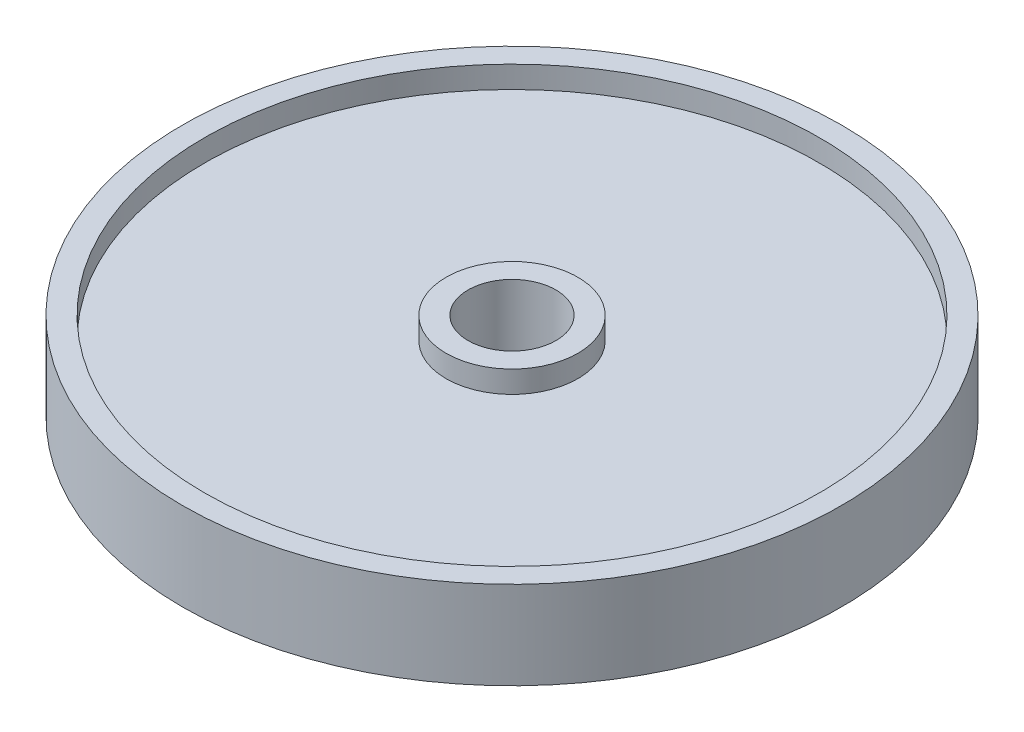
ISO-10303-21;
HEADER;
FILE_DESCRIPTION(('STEP AP214'),'2;1');
FILE_NAME('part.step','',(''),(''),'','','');
FILE_SCHEMA(('AUTOMOTIVE_DESIGN { 1 0 10303 214 1 1 1 1 }'));
ENDSEC;
DATA;
#1=APPLICATION_CONTEXT('core data for automotive mechanical design processes');
#2=APPLICATION_PROTOCOL_DEFINITION('international standard','automotive_design',2000,#1);
#3=PRODUCT_CONTEXT('',#1,'mechanical');
#4=PRODUCT('Part','Part','',(#3));
#5=PRODUCT_RELATED_PRODUCT_CATEGORY('part','',(#4));
#6=PRODUCT_DEFINITION_FORMATION('','',#4);
#7=PRODUCT_DEFINITION_CONTEXT('part definition',#1,'design');
#8=PRODUCT_DEFINITION('design','',#6,#7);
#9=PRODUCT_DEFINITION_SHAPE('','',#8);
#10=(LENGTH_UNIT() NAMED_UNIT(*) SI_UNIT(.MILLI.,.METRE.));
#11=(NAMED_UNIT(*) PLANE_ANGLE_UNIT() SI_UNIT($,.RADIAN.));
#12=(NAMED_UNIT(*) SI_UNIT($,.STERADIAN.) SOLID_ANGLE_UNIT());
#13=UNCERTAINTY_MEASURE_WITH_UNIT(LENGTH_MEASURE(1.E-05),#10,'distance_accuracy_value','');
#14=(GEOMETRIC_REPRESENTATION_CONTEXT(3) GLOBAL_UNCERTAINTY_ASSIGNED_CONTEXT((#13)) GLOBAL_UNIT_ASSIGNED_CONTEXT((#10,
#11,#12)) REPRESENTATION_CONTEXT('',''));
#15=CARTESIAN_POINT('',(0.,0.,0.));
#16=DIRECTION('',(0.,0.,1.));
#17=DIRECTION('',(1.,0.,0.));
#18=AXIS2_PLACEMENT_3D('',#15,#16,#17);
#19=CARTESIAN_POINT('',(0.,2.5,0.));
#20=DIRECTION('',(0.,1.,0.));
#21=DIRECTION('',(0.,0.,1.));
#22=AXIS2_PLACEMENT_3D('',#19,#20,#21);
#23=PLANE('',#22);
#24=CARTESIAN_POINT('',(0.,2.5,0.));
#25=DIRECTION('',(0.,1.,0.));
#26=DIRECTION('',(0.,0.,1.));
#27=AXIS2_PLACEMENT_3D('',#24,#25,#26);
#28=CIRCLE('',#27,7.5);
#29=CARTESIAN_POINT('',(0.,2.5,7.5));
#30=VERTEX_POINT('',#29);
#31=EDGE_CURVE('E11',#30,#30,#28,.T.);
#32=ORIENTED_EDGE('',*,*,#31,.F.);
#33=EDGE_LOOP('',(#32));
#34=FACE_BOUND('',#33,.T.);
#35=CARTESIAN_POINT('',(0.,2.5,0.));
#36=DIRECTION('',(0.,1.,0.));
#37=DIRECTION('',(0.,0.,1.));
#38=AXIS2_PLACEMENT_3D('',#35,#36,#37);
#39=CIRCLE('',#38,35.);
#40=CARTESIAN_POINT('',(0.,2.5,35.));
#41=VERTEX_POINT('',#40);
#42=EDGE_CURVE('E57',#41,#41,#39,.F.);
#43=ORIENTED_EDGE('',*,*,#42,.F.);
#44=EDGE_LOOP('',(#43));
#45=FACE_BOUND('',#44,.T.);
#46=ADVANCED_FACE('F46',(#34,#45),#23,.T.);
#47=CARTESIAN_POINT('',(0.,-2.5,0.));
#48=DIRECTION('',(0.,1.,0.));
#49=DIRECTION('',(0.,0.,1.));
#50=AXIS2_PLACEMENT_3D('',#47,#48,#49);
#51=PLANE('',#50);
#52=CARTESIAN_POINT('',(0.,-2.5,0.));
#53=DIRECTION('',(0.,1.,0.));
#54=DIRECTION('',(0.,0.,1.));
#55=AXIS2_PLACEMENT_3D('',#52,#53,#54);
#56=CIRCLE('',#55,7.5);
#57=CARTESIAN_POINT('',(0.,-2.5,7.5));
#58=VERTEX_POINT('',#57);
#59=EDGE_CURVE('E69',#58,#58,#56,.F.);
#60=ORIENTED_EDGE('',*,*,#59,.F.);
#61=EDGE_LOOP('',(#60));
#62=FACE_BOUND('',#61,.T.);
#63=CARTESIAN_POINT('',(0.,-2.5,0.));
#64=DIRECTION('',(0.,1.,0.));
#65=DIRECTION('',(0.,0.,1.));
#66=AXIS2_PLACEMENT_3D('',#63,#64,#65);
#67=CIRCLE('',#66,35.);
#68=CARTESIAN_POINT('',(0.,-2.5,35.));
#69=VERTEX_POINT('',#68);
#70=EDGE_CURVE('E50',#69,#69,#67,.T.);
#71=ORIENTED_EDGE('',*,*,#70,.F.);
#72=EDGE_LOOP('',(#71));
#73=FACE_BOUND('',#72,.T.);
#74=ADVANCED_FACE('F48',(#62,#73),#51,.F.);
#75=CARTESIAN_POINT('',(0.,5.,0.));
#76=DIRECTION('',(0.,-1.,0.));
#77=DIRECTION('',(0.,0.,-1.));
#78=AXIS2_PLACEMENT_3D('',#75,#76,#77);
#79=CYLINDRICAL_SURFACE('',#78,35.);
#80=CARTESIAN_POINT('',(0.,-5.,0.));
#81=DIRECTION('',(0.,1.,0.));
#82=DIRECTION('',(0.,0.,1.));
#83=AXIS2_PLACEMENT_3D('',#80,#81,#82);
#84=CIRCLE('',#83,35.);
#85=CARTESIAN_POINT('',(0.,-5.,35.));
#86=VERTEX_POINT('',#85);
#87=EDGE_CURVE('E66',#86,#86,#84,.T.);
#88=ORIENTED_EDGE('',*,*,#87,.F.);
#89=EDGE_LOOP('',(#88));
#90=FACE_BOUND('',#89,.T.);
#91=ORIENTED_EDGE('',*,*,#70,.T.);
#92=EDGE_LOOP('',(#91));
#93=FACE_BOUND('',#92,.T.);
#94=ADVANCED_FACE('F116',(#90,#93),#79,.F.);
#95=ORIENTED_EDGE('',*,*,#42,.T.);
#96=EDGE_LOOP('',(#95));
#97=FACE_BOUND('',#96,.T.);
#98=CARTESIAN_POINT('',(0.,5.,0.));
#99=DIRECTION('',(0.,1.,0.));
#100=DIRECTION('',(0.,0.,1.));
#101=AXIS2_PLACEMENT_3D('',#98,#99,#100);
#102=CIRCLE('',#101,35.);
#103=CARTESIAN_POINT('',(0.,5.,35.));
#104=VERTEX_POINT('',#103);
#105=EDGE_CURVE('E65',#104,#104,#102,.T.);
#106=ORIENTED_EDGE('',*,*,#105,.T.);
#107=EDGE_LOOP('',(#106));
#108=FACE_BOUND('',#107,.T.);
#109=ADVANCED_FACE('F120',(#97,#108),#79,.F.);
#110=CARTESIAN_POINT('',(0.,5.,0.));
#111=DIRECTION('',(0.,-1.,0.));
#112=DIRECTION('',(0.,0.,-1.));
#113=AXIS2_PLACEMENT_3D('',#110,#111,#112);
#114=CYLINDRICAL_SURFACE('',#113,37.5);
#115=CARTESIAN_POINT('',(0.,5.,0.));
#116=DIRECTION('',(0.,1.,0.));
#117=DIRECTION('',(0.,0.,1.));
#118=AXIS2_PLACEMENT_3D('',#115,#116,#117);
#119=CIRCLE('',#118,37.5);
#120=CARTESIAN_POINT('',(0.,5.,37.5));
#121=VERTEX_POINT('',#120);
#122=EDGE_CURVE('E61',#121,#121,#119,.T.);
#123=ORIENTED_EDGE('',*,*,#122,.F.);
#124=EDGE_LOOP('',(#123));
#125=FACE_BOUND('',#124,.T.);
#126=CARTESIAN_POINT('',(0.,-5.,0.));
#127=DIRECTION('',(0.,1.,0.));
#128=DIRECTION('',(0.,0.,1.));
#129=AXIS2_PLACEMENT_3D('',#126,#127,#128);
#130=CIRCLE('',#129,37.5);
#131=CARTESIAN_POINT('',(0.,-5.,37.5));
#132=VERTEX_POINT('',#131);
#133=EDGE_CURVE('E62',#132,#132,#130,.T.);
#134=ORIENTED_EDGE('',*,*,#133,.T.);
#135=EDGE_LOOP('',(#134));
#136=FACE_BOUND('',#135,.T.);
#137=ADVANCED_FACE('F123',(#125,#136),#114,.T.);
#138=CARTESIAN_POINT('',(0.,5.,0.));
#139=DIRECTION('',(0.,1.,0.));
#140=DIRECTION('',(0.,0.,1.));
#141=AXIS2_PLACEMENT_3D('',#138,#139,#140);
#142=PLANE('',#141);
#143=ORIENTED_EDGE('',*,*,#105,.F.);
#144=EDGE_LOOP('',(#143));
#145=FACE_BOUND('',#144,.T.);
#146=ORIENTED_EDGE('',*,*,#122,.T.);
#147=EDGE_LOOP('',(#146));
#148=FACE_BOUND('',#147,.T.);
#149=ADVANCED_FACE('F127',(#145,#148),#142,.T.);
#150=CARTESIAN_POINT('',(0.,-5.,0.));
#151=DIRECTION('',(0.,1.,0.));
#152=DIRECTION('',(0.,0.,1.));
#153=AXIS2_PLACEMENT_3D('',#150,#151,#152);
#154=PLANE('',#153);
#155=ORIENTED_EDGE('',*,*,#87,.T.);
#156=EDGE_LOOP('',(#155));
#157=FACE_BOUND('',#156,.T.);
#158=ORIENTED_EDGE('',*,*,#133,.F.);
#159=EDGE_LOOP('',(#158));
#160=FACE_BOUND('',#159,.T.);
#161=ADVANCED_FACE('F109',(#157,#160),#154,.F.);
#162=CARTESIAN_POINT('',(0.,5.,0.));
#163=DIRECTION('',(0.,-1.,0.));
#164=DIRECTION('',(0.,0.,-1.));
#165=AXIS2_PLACEMENT_3D('',#162,#163,#164);
#166=CYLINDRICAL_SURFACE('',#165,7.5);
#167=CARTESIAN_POINT('',(0.,-5.,0.));
#168=DIRECTION('',(0.,1.,0.));
#169=DIRECTION('',(0.,0.,1.));
#170=AXIS2_PLACEMENT_3D('',#167,#168,#169);
#171=CIRCLE('',#170,7.5);
#172=CARTESIAN_POINT('',(0.,-5.,7.5));
#173=VERTEX_POINT('',#172);
#174=EDGE_CURVE('E77',#173,#173,#171,.T.);
#175=ORIENTED_EDGE('',*,*,#174,.T.);
#176=EDGE_LOOP('',(#175));
#177=FACE_BOUND('',#176,.T.);
#178=ORIENTED_EDGE('',*,*,#59,.T.);
#179=EDGE_LOOP('',(#178));
#180=FACE_BOUND('',#179,.T.);
#181=ADVANCED_FACE('F102',(#177,#180),#166,.T.);
#182=CARTESIAN_POINT('',(0.,5.,0.));
#183=DIRECTION('',(0.,-1.,0.));
#184=DIRECTION('',(0.,0.,-1.));
#185=AXIS2_PLACEMENT_3D('',#182,#183,#184);
#186=CYLINDRICAL_SURFACE('',#185,5.);
#187=CARTESIAN_POINT('',(0.,5.,0.));
#188=DIRECTION('',(0.,1.,0.));
#189=DIRECTION('',(0.,0.,1.));
#190=AXIS2_PLACEMENT_3D('',#187,#188,#189);
#191=CIRCLE('',#190,5.);
#192=CARTESIAN_POINT('',(0.,5.,5.));
#193=VERTEX_POINT('',#192);
#194=EDGE_CURVE('E80',#193,#193,#191,.T.);
#195=ORIENTED_EDGE('',*,*,#194,.T.);
#196=EDGE_LOOP('',(#195));
#197=FACE_BOUND('',#196,.T.);
#198=CARTESIAN_POINT('',(0.,-5.,0.));
#199=DIRECTION('',(0.,1.,0.));
#200=DIRECTION('',(0.,0.,1.));
#201=AXIS2_PLACEMENT_3D('',#198,#199,#200);
#202=CIRCLE('',#201,5.);
#203=CARTESIAN_POINT('',(0.,-5.,5.));
#204=VERTEX_POINT('',#203);
#205=EDGE_CURVE('E81',#204,#204,#202,.T.);
#206=ORIENTED_EDGE('',*,*,#205,.F.);
#207=EDGE_LOOP('',(#206));
#208=FACE_BOUND('',#207,.T.);
#209=ADVANCED_FACE('F89',(#197,#208),#186,.F.);
#210=ORIENTED_EDGE('',*,*,#31,.T.);
#211=EDGE_LOOP('',(#210));
#212=FACE_BOUND('',#211,.T.);
#213=CARTESIAN_POINT('',(0.,5.,0.));
#214=DIRECTION('',(0.,1.,0.));
#215=DIRECTION('',(0.,0.,1.));
#216=AXIS2_PLACEMENT_3D('',#213,#214,#215);
#217=CIRCLE('',#216,7.5);
#218=CARTESIAN_POINT('',(0.,5.,7.5));
#219=VERTEX_POINT('',#218);
#220=EDGE_CURVE('E76',#219,#219,#217,.T.);
#221=ORIENTED_EDGE('',*,*,#220,.F.);
#222=EDGE_LOOP('',(#221));
#223=FACE_BOUND('',#222,.T.);
#224=ADVANCED_FACE('F96',(#212,#223),#166,.T.);
#225=CARTESIAN_POINT('',(0.,5.,0.));
#226=DIRECTION('',(0.,1.,0.));
#227=DIRECTION('',(0.,0.,1.));
#228=AXIS2_PLACEMENT_3D('',#225,#226,#227);
#229=PLANE('',#228);
#230=ORIENTED_EDGE('',*,*,#194,.F.);
#231=EDGE_LOOP('',(#230));
#232=FACE_BOUND('',#231,.T.);
#233=ORIENTED_EDGE('',*,*,#220,.T.);
#234=EDGE_LOOP('',(#233));
#235=FACE_BOUND('',#234,.T.);
#236=ADVANCED_FACE('F92',(#232,#235),#229,.T.);
#237=CARTESIAN_POINT('',(0.,-5.,0.));
#238=DIRECTION('',(0.,1.,0.));
#239=DIRECTION('',(0.,0.,1.));
#240=AXIS2_PLACEMENT_3D('',#237,#238,#239);
#241=PLANE('',#240);
#242=ORIENTED_EDGE('',*,*,#205,.T.);
#243=EDGE_LOOP('',(#242));
#244=FACE_BOUND('',#243,.T.);
#245=ORIENTED_EDGE('',*,*,#174,.F.);
#246=EDGE_LOOP('',(#245));
#247=FACE_BOUND('',#246,.T.);
#248=ADVANCED_FACE('F95',(#244,#247),#241,.F.);
#249=CLOSED_SHELL('',(#46,#74,#94,#109,#137,#149,#161,#181,#209,#224,#236,#248));
#250=MANIFOLD_SOLID_BREP('B2',#249);
#251=ADVANCED_BREP_SHAPE_REPRESENTATION('',(#18,#250),#14);
#252=SHAPE_DEFINITION_REPRESENTATION(#9,#251);
ENDSEC;
END-ISO-10303-21;
